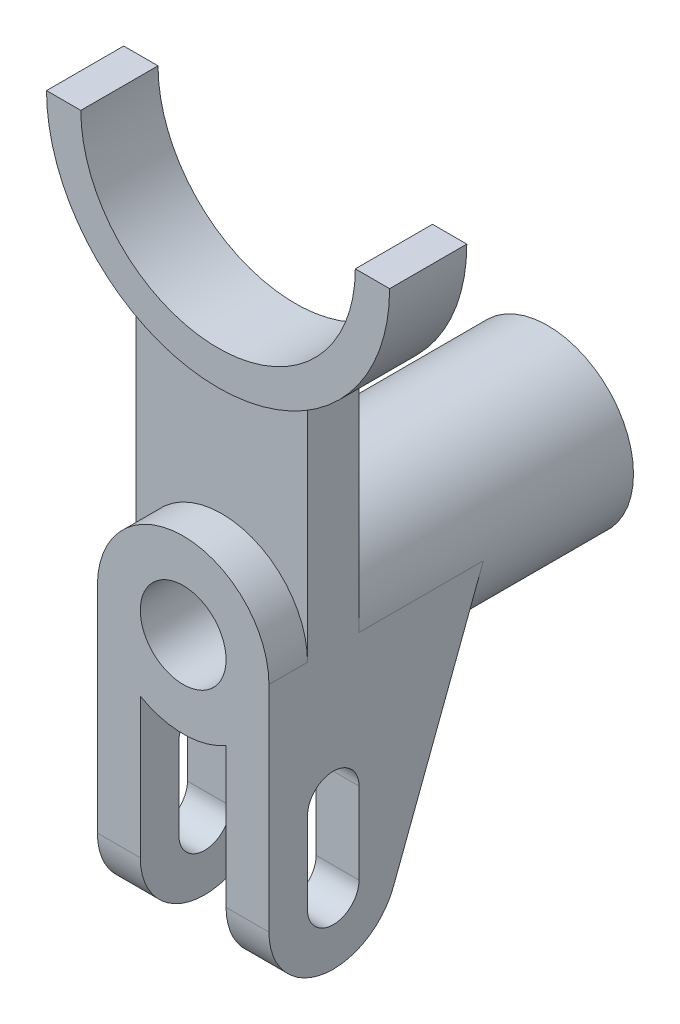
ISO-10303-21;
HEADER;
FILE_DESCRIPTION(('STEP AP214'),'2;1');
FILE_NAME('part.step','',(''),(''),'','','');
FILE_SCHEMA(('AUTOMOTIVE_DESIGN { 1 0 10303 214 1 1 1 1 }'));
ENDSEC;
DATA;
#1=APPLICATION_CONTEXT('core data for automotive mechanical design processes');
#2=APPLICATION_PROTOCOL_DEFINITION('international standard','automotive_design',2000,#1);
#3=PRODUCT_CONTEXT('',#1,'mechanical');
#4=PRODUCT('Part','Part','',(#3));
#5=PRODUCT_RELATED_PRODUCT_CATEGORY('part','',(#4));
#6=PRODUCT_DEFINITION_FORMATION('','',#4);
#7=PRODUCT_DEFINITION_CONTEXT('part definition',#1,'design');
#8=PRODUCT_DEFINITION('design','',#6,#7);
#9=PRODUCT_DEFINITION_SHAPE('','',#8);
#10=(LENGTH_UNIT() NAMED_UNIT(*) SI_UNIT(.MILLI.,.METRE.));
#11=(NAMED_UNIT(*) PLANE_ANGLE_UNIT() SI_UNIT($,.RADIAN.));
#12=(NAMED_UNIT(*) SI_UNIT($,.STERADIAN.) SOLID_ANGLE_UNIT());
#13=UNCERTAINTY_MEASURE_WITH_UNIT(LENGTH_MEASURE(1.E-05),#10,'distance_accuracy_value','');
#14=(GEOMETRIC_REPRESENTATION_CONTEXT(3) GLOBAL_UNCERTAINTY_ASSIGNED_CONTEXT((#13)) GLOBAL_UNIT_ASSIGNED_CONTEXT((#10,
#11,#12)) REPRESENTATION_CONTEXT('',''));
#15=CARTESIAN_POINT('',(0.,0.,0.));
#16=DIRECTION('',(0.,0.,1.));
#17=DIRECTION('',(1.,0.,0.));
#18=AXIS2_PLACEMENT_3D('',#15,#16,#17);
#19=CARTESIAN_POINT('',(0.,0.,-70.));
#20=DIRECTION('',(0.,0.,1.));
#21=DIRECTION('',(1.,0.,0.));
#22=AXIS2_PLACEMENT_3D('',#19,#20,#21);
#23=CYLINDRICAL_SURFACE('',#22,20.);
#24=CARTESIAN_POINT('',(0.,0.,6.));
#25=DIRECTION('',(0.,0.,1.));
#26=DIRECTION('',(1.,0.,0.));
#27=AXIS2_PLACEMENT_3D('',#24,#25,#26);
#28=CIRCLE('',#27,20.);
#29=CARTESIAN_POINT('',(20.,0.,6.00000000000001));
#30=VERTEX_POINT('',#29);
#31=CARTESIAN_POINT('',(-20.,0.,6.00000000000001));
#32=VERTEX_POINT('',#31);
#33=EDGE_CURVE('E388',#30,#32,#28,.T.);
#34=ORIENTED_EDGE('',*,*,#33,.T.);
#35=DIRECTION('',(0.,0.,1.));
#36=VECTOR('',#35,1.);
#37=CARTESIAN_POINT('',(-20.,0.,-35.));
#38=LINE('',#37,#36);
#39=CARTESIAN_POINT('',(-20.,0.,15.));
#40=VERTEX_POINT('',#39);
#41=EDGE_CURVE('E252',#32,#40,#38,.T.);
#42=ORIENTED_EDGE('',*,*,#41,.T.);
#43=CARTESIAN_POINT('',(0.,0.,15.));
#44=DIRECTION('',(0.,0.,1.));
#45=DIRECTION('',(1.,0.,0.));
#46=AXIS2_PLACEMENT_3D('',#43,#44,#45);
#47=CIRCLE('',#46,20.);
#48=CARTESIAN_POINT('',(20.,0.,15.));
#49=VERTEX_POINT('',#48);
#50=EDGE_CURVE('E371',#49,#40,#47,.T.);
#51=ORIENTED_EDGE('',*,*,#50,.F.);
#52=DIRECTION('',(0.,0.,1.));
#53=VECTOR('',#52,1.);
#54=CARTESIAN_POINT('',(20.,0.,-35.));
#55=LINE('',#54,#53);
#56=EDGE_CURVE('E325',#30,#49,#55,.T.);
#57=ORIENTED_EDGE('',*,*,#56,.F.);
#58=EDGE_LOOP('',(#34,#42,#51,#57));
#59=FACE_BOUND('',#58,.T.);
#60=ADVANCED_FACE('F41',(#59),#23,.T.);
#61=CARTESIAN_POINT('',(0.,0.,-70.));
#62=DIRECTION('',(0.,0.,1.));
#63=DIRECTION('',(1.,0.,0.));
#64=AXIS2_PLACEMENT_3D('',#61,#62,#63);
#65=CIRCLE('',#64,20.);
#66=CARTESIAN_POINT('',(20.,0.,-70.));
#67=VERTEX_POINT('',#66);
#68=EDGE_CURVE('E375',#67,#67,#65,.T.);
#69=ORIENTED_EDGE('',*,*,#68,.T.);
#70=EDGE_LOOP('',(#69));
#71=FACE_BOUND('',#70,.T.);
#72=CARTESIAN_POINT('',(-10.,-17.3205080756888,15.));
#73=VERTEX_POINT('',#72);
#74=CARTESIAN_POINT('',(10.,-17.3205080756888,15.));
#75=VERTEX_POINT('',#74);
#76=EDGE_CURVE('E370',#73,#75,#47,.T.);
#77=ORIENTED_EDGE('',*,*,#76,.F.);
#78=DIRECTION('',(0.,0.,1.));
#79=VECTOR('',#78,1.);
#80=CARTESIAN_POINT('',(-10.,-17.3205080756888,-70.));
#81=LINE('',#80,#79);
#82=CARTESIAN_POINT('',(-10.,-17.3205080756888,-28.4327635237293));
#83=VERTEX_POINT('',#82);
#84=EDGE_CURVE('E60',#73,#83,#81,.F.);
#85=ORIENTED_EDGE('',*,*,#84,.T.);
#86=CARTESIAN_POINT('',(0.,0.,-35.));
#87=DIRECTION('',(0.,0.354530986331507,0.935044266187868));
#88=DIRECTION('',(0.,-0.935044266187868,0.354530986331507));
#89=AXIS2_PLACEMENT_3D('',#86,#87,#88);
#90=ELLIPSE('',#89,21.3893616839544,20.);
#91=CARTESIAN_POINT('',(-20.,0.,-35.));
#92=VERTEX_POINT('',#91);
#93=EDGE_CURVE('E11',#83,#92,#90,.F.);
#94=ORIENTED_EDGE('',*,*,#93,.T.);
#95=CARTESIAN_POINT('',(-20.,0.,-6.));
#96=VERTEX_POINT('',#95);
#97=EDGE_CURVE('E270',#92,#96,#38,.T.);
#98=ORIENTED_EDGE('',*,*,#97,.T.);
#99=CARTESIAN_POINT('',(0.,0.,-6.));
#100=DIRECTION('',(0.,0.,1.));
#101=DIRECTION('',(1.,0.,0.));
#102=AXIS2_PLACEMENT_3D('',#99,#100,#101);
#103=CIRCLE('',#102,20.);
#104=CARTESIAN_POINT('',(20.,0.,-6.00000000000001));
#105=VERTEX_POINT('',#104);
#106=EDGE_CURVE('E403',#105,#96,#103,.T.);
#107=ORIENTED_EDGE('',*,*,#106,.F.);
#108=CARTESIAN_POINT('',(20.,0.,-35.));
#109=VERTEX_POINT('',#108);
#110=EDGE_CURVE('E348',#109,#105,#55,.T.);
#111=ORIENTED_EDGE('',*,*,#110,.F.);
#112=CARTESIAN_POINT('',(0.,0.,-35.));
#113=DIRECTION('',(0.,-0.354530986331507,-0.935044266187868));
#114=DIRECTION('',(0.,-0.935044266187868,0.354530986331507));
#115=AXIS2_PLACEMENT_3D('',#112,#113,#114);
#116=ELLIPSE('',#115,21.3893616839544,20.);
#117=CARTESIAN_POINT('',(10.,-17.3205080756888,-28.4327635237293));
#118=VERTEX_POINT('',#117);
#119=EDGE_CURVE('E50',#118,#109,#116,.F.);
#120=ORIENTED_EDGE('',*,*,#119,.F.);
#121=DIRECTION('',(0.,0.,1.));
#122=VECTOR('',#121,1.);
#123=CARTESIAN_POINT('',(10.,-17.3205080756888,-70.));
#124=LINE('',#123,#122);
#125=EDGE_CURVE('E364',#118,#75,#124,.T.);
#126=ORIENTED_EDGE('',*,*,#125,.T.);
#127=EDGE_LOOP('',(#77,#85,#94,#98,#107,#111,#120,#126));
#128=FACE_BOUND('',#127,.T.);
#129=ADVANCED_FACE('F466',(#71,#128),#23,.T.);
#130=CARTESIAN_POINT('',(2.13738691173234,88.,9.));
#131=DIRECTION('',(0.,0.,-1.));
#132=DIRECTION('',(-1.,0.,0.));
#133=AXIS2_PLACEMENT_3D('',#130,#131,#132);
#134=CYLINDRICAL_SURFACE('',#133,32.);
#135=CARTESIAN_POINT('',(2.13738691173234,88.,-9.));
#136=DIRECTION('',(0.,0.,1.));
#137=DIRECTION('',(1.,0.,0.));
#138=AXIS2_PLACEMENT_3D('',#135,#136,#137);
#139=CIRCLE('',#138,32.);
#140=CARTESIAN_POINT('',(-29.8626130882677,88.,-9.));
#141=VERTEX_POINT('',#140);
#142=CARTESIAN_POINT('',(34.1373869117323,88.,-9.));
#143=VERTEX_POINT('',#142);
#144=EDGE_CURVE('E415',#141,#143,#139,.T.);
#145=ORIENTED_EDGE('',*,*,#144,.F.);
#146=DIRECTION('',(0.,0.,-1.));
#147=VECTOR('',#146,1.);
#148=CARTESIAN_POINT('',(-29.8626130882677,88.,9.));
#149=LINE('',#148,#147);
#150=CARTESIAN_POINT('',(-29.8626130882677,88.,9.));
#151=VERTEX_POINT('',#150);
#152=EDGE_CURVE('E455',#151,#141,#149,.T.);
#153=ORIENTED_EDGE('',*,*,#152,.F.);
#154=CARTESIAN_POINT('',(2.13738691173234,88.,9.));
#155=DIRECTION('',(0.,0.,1.));
#156=DIRECTION('',(1.,0.,0.));
#157=AXIS2_PLACEMENT_3D('',#154,#155,#156);
#158=CIRCLE('',#157,32.);
#159=CARTESIAN_POINT('',(34.1373869117323,88.,9.));
#160=VERTEX_POINT('',#159);
#161=EDGE_CURVE('E416',#151,#160,#158,.T.);
#162=ORIENTED_EDGE('',*,*,#161,.T.);
#163=DIRECTION('',(0.,0.,-1.));
#164=VECTOR('',#163,1.);
#165=CARTESIAN_POINT('',(34.1373869117323,88.,9.));
#166=LINE('',#165,#164);
#167=EDGE_CURVE('E432',#160,#143,#166,.T.);
#168=ORIENTED_EDGE('',*,*,#167,.T.);
#169=EDGE_LOOP('',(#145,#153,#162,#168));
#170=FACE_BOUND('',#169,.T.);
#171=ADVANCED_FACE('F43',(#170),#134,.F.);
#172=CARTESIAN_POINT('',(0.,88.,9.));
#173=DIRECTION('',(0.,1.,0.));
#174=DIRECTION('',(0.,0.,1.));
#175=AXIS2_PLACEMENT_3D('',#172,#173,#174);
#176=PLANE('',#175);
#177=DIRECTION('',(1.,0.,0.));
#178=VECTOR('',#177,1.);
#179=CARTESIAN_POINT('',(0.,88.,-9.));
#180=LINE('',#179,#178);
#181=CARTESIAN_POINT('',(-37.8626130882677,88.,-9.));
#182=VERTEX_POINT('',#181);
#183=EDGE_CURVE('E436',#182,#141,#180,.T.);
#184=ORIENTED_EDGE('',*,*,#183,.F.);
#185=DIRECTION('',(0.,0.,-1.));
#186=VECTOR('',#185,1.);
#187=CARTESIAN_POINT('',(-37.8626130882677,88.,9.));
#188=LINE('',#187,#186);
#189=CARTESIAN_POINT('',(-37.8626130882677,88.,9.));
#190=VERTEX_POINT('',#189);
#191=EDGE_CURVE('E452',#190,#182,#188,.T.);
#192=ORIENTED_EDGE('',*,*,#191,.F.);
#193=DIRECTION('',(1.,0.,0.));
#194=VECTOR('',#193,1.);
#195=CARTESIAN_POINT('',(0.,88.,9.));
#196=LINE('',#195,#194);
#197=EDGE_CURVE('E420',#190,#151,#196,.T.);
#198=ORIENTED_EDGE('',*,*,#197,.T.);
#199=ORIENTED_EDGE('',*,*,#152,.T.);
#200=EDGE_LOOP('',(#184,#192,#198,#199));
#201=FACE_BOUND('',#200,.T.);
#202=ADVANCED_FACE('F550',(#201),#176,.T.);
#203=CARTESIAN_POINT('',(2.13738691173234,88.,9.));
#204=DIRECTION('',(0.,0.,-1.));
#205=DIRECTION('',(-1.,0.,0.));
#206=AXIS2_PLACEMENT_3D('',#203,#204,#205);
#207=CYLINDRICAL_SURFACE('',#206,40.);
#208=DIRECTION('',(0.,0.,-1.));
#209=VECTOR('',#208,1.);
#210=CARTESIAN_POINT('',(-20.,54.6842964846867,6.));
#211=LINE('',#210,#209);
#212=CARTESIAN_POINT('',(-20.,54.6842964846867,6.));
#213=VERTEX_POINT('',#212);
#214=CARTESIAN_POINT('',(-20.,54.6842964846867,-6.));
#215=VERTEX_POINT('',#214);
#216=EDGE_CURVE('E411',#213,#215,#211,.T.);
#217=ORIENTED_EDGE('',*,*,#216,.F.);
#218=CARTESIAN_POINT('',(2.13738691173234,88.,6.));
#219=DIRECTION('',(0.,0.,1.));
#220=DIRECTION('',(1.,0.,0.));
#221=AXIS2_PLACEMENT_3D('',#218,#219,#220);
#222=CIRCLE('',#221,40.);
#223=CARTESIAN_POINT('',(20.,52.209958736279,6.));
#224=VERTEX_POINT('',#223);
#225=EDGE_CURVE('E380',#213,#224,#222,.T.);
#226=ORIENTED_EDGE('',*,*,#225,.T.);
#227=DIRECTION('',(0.,0.,-1.));
#228=VECTOR('',#227,1.);
#229=CARTESIAN_POINT('',(20.,52.209958736279,6.));
#230=LINE('',#229,#228);
#231=CARTESIAN_POINT('',(20.,52.209958736279,-6.));
#232=VERTEX_POINT('',#231);
#233=EDGE_CURVE('E395',#224,#232,#230,.T.);
#234=ORIENTED_EDGE('',*,*,#233,.T.);
#235=CARTESIAN_POINT('',(2.13738691173234,88.,-6.));
#236=DIRECTION('',(0.,0.,1.));
#237=DIRECTION('',(1.,0.,0.));
#238=AXIS2_PLACEMENT_3D('',#235,#236,#237);
#239=CIRCLE('',#238,40.);
#240=EDGE_CURVE('E379',#215,#232,#239,.T.);
#241=ORIENTED_EDGE('',*,*,#240,.F.);
#242=EDGE_LOOP('',(#217,#226,#234,#241));
#243=FACE_BOUND('',#242,.T.);
#244=CARTESIAN_POINT('',(2.13738691173234,88.,-9.));
#245=DIRECTION('',(0.,0.,1.));
#246=DIRECTION('',(1.,0.,0.));
#247=AXIS2_PLACEMENT_3D('',#244,#245,#246);
#248=CIRCLE('',#247,40.);
#249=CARTESIAN_POINT('',(42.1373869117323,88.,-9.));
#250=VERTEX_POINT('',#249);
#251=EDGE_CURVE('E440',#182,#250,#248,.T.);
#252=ORIENTED_EDGE('',*,*,#251,.T.);
#253=DIRECTION('',(0.,0.,-1.));
#254=VECTOR('',#253,1.);
#255=CARTESIAN_POINT('',(42.1373869117323,88.,9.));
#256=LINE('',#255,#254);
#257=CARTESIAN_POINT('',(42.1373869117323,88.,9.));
#258=VERTEX_POINT('',#257);
#259=EDGE_CURVE('E449',#258,#250,#256,.T.);
#260=ORIENTED_EDGE('',*,*,#259,.F.);
#261=CARTESIAN_POINT('',(2.13738691173234,88.,9.));
#262=DIRECTION('',(0.,0.,1.));
#263=DIRECTION('',(1.,0.,0.));
#264=AXIS2_PLACEMENT_3D('',#261,#262,#263);
#265=CIRCLE('',#264,40.);
#266=EDGE_CURVE('E425',#190,#258,#265,.T.);
#267=ORIENTED_EDGE('',*,*,#266,.F.);
#268=ORIENTED_EDGE('',*,*,#191,.T.);
#269=EDGE_LOOP('',(#252,#260,#267,#268));
#270=FACE_BOUND('',#269,.T.);
#271=ADVANCED_FACE('F506',(#243,#270),#207,.T.);
#272=CARTESIAN_POINT('',(0.,88.,9.));
#273=DIRECTION('',(0.,1.,0.));
#274=DIRECTION('',(0.,0.,1.));
#275=AXIS2_PLACEMENT_3D('',#272,#273,#274);
#276=PLANE('',#275);
#277=DIRECTION('',(1.,0.,0.));
#278=VECTOR('',#277,1.);
#279=CARTESIAN_POINT('',(0.,88.,-9.));
#280=LINE('',#279,#278);
#281=EDGE_CURVE('E421',#143,#250,#280,.T.);
#282=ORIENTED_EDGE('',*,*,#281,.F.);
#283=ORIENTED_EDGE('',*,*,#167,.F.);
#284=DIRECTION('',(1.,0.,0.));
#285=VECTOR('',#284,1.);
#286=CARTESIAN_POINT('',(0.,88.,9.));
#287=LINE('',#286,#285);
#288=EDGE_CURVE('E428',#160,#258,#287,.T.);
#289=ORIENTED_EDGE('',*,*,#288,.T.);
#290=ORIENTED_EDGE('',*,*,#259,.T.);
#291=EDGE_LOOP('',(#282,#283,#289,#290));
#292=FACE_BOUND('',#291,.T.);
#293=ADVANCED_FACE('F541',(#292),#276,.T.);
#294=CARTESIAN_POINT('',(0.,0.,9.));
#295=DIRECTION('',(0.,0.,1.));
#296=DIRECTION('',(1.,0.,0.));
#297=AXIS2_PLACEMENT_3D('',#294,#295,#296);
#298=PLANE('',#297);
#299=ORIENTED_EDGE('',*,*,#161,.F.);
#300=ORIENTED_EDGE('',*,*,#197,.F.);
#301=ORIENTED_EDGE('',*,*,#266,.T.);
#302=ORIENTED_EDGE('',*,*,#288,.F.);
#303=EDGE_LOOP('',(#299,#300,#301,#302));
#304=FACE_BOUND('',#303,.T.);
#305=ADVANCED_FACE('F538',(#304),#298,.T.);
#306=CARTESIAN_POINT('',(0.,0.,-9.));
#307=DIRECTION('',(0.,0.,1.));
#308=DIRECTION('',(1.,0.,0.));
#309=AXIS2_PLACEMENT_3D('',#306,#307,#308);
#310=PLANE('',#309);
#311=ORIENTED_EDGE('',*,*,#144,.T.);
#312=ORIENTED_EDGE('',*,*,#281,.T.);
#313=ORIENTED_EDGE('',*,*,#251,.F.);
#314=ORIENTED_EDGE('',*,*,#183,.T.);
#315=EDGE_LOOP('',(#311,#312,#313,#314));
#316=FACE_BOUND('',#315,.T.);
#317=ADVANCED_FACE('F537',(#316),#310,.F.);
#318=CARTESIAN_POINT('',(-20.,0.,6.));
#319=DIRECTION('',(-1.,0.,0.));
#320=DIRECTION('',(0.,0.,1.));
#321=AXIS2_PLACEMENT_3D('',#318,#319,#320);
#322=PLANE('',#321);
#323=DIRECTION('',(0.,1.,0.));
#324=VECTOR('',#323,1.);
#325=CARTESIAN_POINT('',(-20.,0.,-6.));
#326=LINE('',#325,#324);
#327=EDGE_CURVE('E399',#96,#215,#326,.T.);
#328=ORIENTED_EDGE('',*,*,#327,.F.);
#329=ORIENTED_EDGE('',*,*,#97,.F.);
#330=DIRECTION('',(0.,0.935044266187868,-0.354530986331507));
#331=VECTOR('',#330,1.);
#332=CARTESIAN_POINT('',(-20.,-55.3179647949726,-14.025663992818));
#333=LINE('',#332,#331);
#334=CARTESIAN_POINT('',(-20.,-55.3179647949726,-14.025663992818));
#335=VERTEX_POINT('',#334);
#336=EDGE_CURVE('E273',#335,#92,#333,.T.);
#337=ORIENTED_EDGE('',*,*,#336,.F.);
#338=CARTESIAN_POINT('',(-20.,-50.,0.));
#339=DIRECTION('',(1.,0.,0.));
#340=DIRECTION('',(0.,0.,-1.));
#341=AXIS2_PLACEMENT_3D('',#338,#339,#340);
#342=CIRCLE('',#341,15.);
#343=CARTESIAN_POINT('',(-20.,-50.,15.));
#344=VERTEX_POINT('',#343);
#345=EDGE_CURVE('E276',#344,#335,#342,.T.);
#346=ORIENTED_EDGE('',*,*,#345,.F.);
#347=DIRECTION('',(0.,-1.,0.));
#348=VECTOR('',#347,1.);
#349=CARTESIAN_POINT('',(-20.,0.,15.));
#350=LINE('',#349,#348);
#351=EDGE_CURVE('E263',#40,#344,#350,.T.);
#352=ORIENTED_EDGE('',*,*,#351,.F.);
#353=ORIENTED_EDGE('',*,*,#41,.F.);
#354=DIRECTION('',(0.,1.,0.));
#355=VECTOR('',#354,1.);
#356=CARTESIAN_POINT('',(-20.,0.,6.));
#357=LINE('',#356,#355);
#358=EDGE_CURVE('E383',#32,#213,#357,.T.);
#359=ORIENTED_EDGE('',*,*,#358,.T.);
#360=ORIENTED_EDGE('',*,*,#216,.T.);
#361=EDGE_LOOP('',(#328,#329,#337,#346,#352,#353,#359,#360));
#362=FACE_BOUND('',#361,.T.);
#363=DIRECTION('',(0.,-1.,0.));
#364=VECTOR('',#363,1.);
#365=CARTESIAN_POINT('',(-20.,-50.,5.99999999999999));
#366=LINE('',#365,#364);
#367=CARTESIAN_POINT('',(-20.,-31.,5.99999999999999));
#368=VERTEX_POINT('',#367);
#369=CARTESIAN_POINT('',(-20.,-50.,5.99999999999999));
#370=VERTEX_POINT('',#369);
#371=EDGE_CURVE('E243',#368,#370,#366,.T.);
#372=ORIENTED_EDGE('',*,*,#371,.T.);
#373=CARTESIAN_POINT('',(-20.,-50.,0.));
#374=DIRECTION('',(1.,0.,0.));
#375=DIRECTION('',(0.,0.,-1.));
#376=AXIS2_PLACEMENT_3D('',#373,#374,#375);
#377=CIRCLE('',#376,6.);
#378=CARTESIAN_POINT('',(-20.,-50.,-6.00000000000001));
#379=VERTEX_POINT('',#378);
#380=EDGE_CURVE('E220',#370,#379,#377,.T.);
#381=ORIENTED_EDGE('',*,*,#380,.T.);
#382=DIRECTION('',(0.,1.,0.));
#383=VECTOR('',#382,1.);
#384=CARTESIAN_POINT('',(-20.,-50.,-6.00000000000001));
#385=LINE('',#384,#383);
#386=CARTESIAN_POINT('',(-20.,-31.,-6.00000000000001));
#387=VERTEX_POINT('',#386);
#388=EDGE_CURVE('E227',#379,#387,#385,.T.);
#389=ORIENTED_EDGE('',*,*,#388,.T.);
#390=CARTESIAN_POINT('',(-20.,-31.,0.));
#391=DIRECTION('',(1.,0.,0.));
#392=DIRECTION('',(0.,0.,-1.));
#393=AXIS2_PLACEMENT_3D('',#390,#391,#392);
#394=CIRCLE('',#393,6.);
#395=EDGE_CURVE('E231',#387,#368,#394,.T.);
#396=ORIENTED_EDGE('',*,*,#395,.T.);
#397=EDGE_LOOP('',(#372,#381,#389,#396));
#398=FACE_BOUND('',#397,.T.);
#399=ADVANCED_FACE('F501',(#362,#398),#322,.T.);
#400=CARTESIAN_POINT('',(20.,0.,6.));
#401=DIRECTION('',(-1.,0.,0.));
#402=DIRECTION('',(0.,0.,1.));
#403=AXIS2_PLACEMENT_3D('',#400,#401,#402);
#404=PLANE('',#403);
#405=DIRECTION('',(0.,1.,0.));
#406=VECTOR('',#405,1.);
#407=CARTESIAN_POINT('',(20.,0.,-6.));
#408=LINE('',#407,#406);
#409=EDGE_CURVE('E384',#105,#232,#408,.T.);
#410=ORIENTED_EDGE('',*,*,#409,.T.);
#411=ORIENTED_EDGE('',*,*,#233,.F.);
#412=DIRECTION('',(0.,1.,0.));
#413=VECTOR('',#412,1.);
#414=CARTESIAN_POINT('',(20.,0.,6.));
#415=LINE('',#414,#413);
#416=EDGE_CURVE('E391',#30,#224,#415,.T.);
#417=ORIENTED_EDGE('',*,*,#416,.F.);
#418=ORIENTED_EDGE('',*,*,#56,.T.);
#419=DIRECTION('',(0.,-1.,0.));
#420=VECTOR('',#419,1.);
#421=CARTESIAN_POINT('',(20.,0.,15.));
#422=LINE('',#421,#420);
#423=CARTESIAN_POINT('',(20.,-50.,15.));
#424=VERTEX_POINT('',#423);
#425=EDGE_CURVE('E351',#49,#424,#422,.T.);
#426=ORIENTED_EDGE('',*,*,#425,.T.);
#427=CARTESIAN_POINT('',(20.,-50.,0.));
#428=DIRECTION('',(1.,0.,0.));
#429=DIRECTION('',(0.,0.,-1.));
#430=AXIS2_PLACEMENT_3D('',#427,#428,#429);
#431=CIRCLE('',#430,15.);
#432=CARTESIAN_POINT('',(20.,-55.3179647949726,-14.025663992818));
#433=VERTEX_POINT('',#432);
#434=EDGE_CURVE('E355',#424,#433,#431,.T.);
#435=ORIENTED_EDGE('',*,*,#434,.T.);
#436=DIRECTION('',(0.,0.935044266187868,-0.354530986331507));
#437=VECTOR('',#436,1.);
#438=CARTESIAN_POINT('',(20.,-55.3179647949726,-14.025663992818));
#439=LINE('',#438,#437);
#440=EDGE_CURVE('E339',#433,#109,#439,.T.);
#441=ORIENTED_EDGE('',*,*,#440,.T.);
#442=ORIENTED_EDGE('',*,*,#110,.T.);
#443=EDGE_LOOP('',(#410,#411,#417,#418,#426,#435,#441,#442));
#444=FACE_BOUND('',#443,.T.);
#445=CARTESIAN_POINT('',(20.,-50.,0.));
#446=DIRECTION('',(1.,0.,0.));
#447=DIRECTION('',(0.,0.,-1.));
#448=AXIS2_PLACEMENT_3D('',#445,#446,#447);
#449=CIRCLE('',#448,6.);
#450=CARTESIAN_POINT('',(20.,-50.,5.99999999999999));
#451=VERTEX_POINT('',#450);
#452=CARTESIAN_POINT('',(20.,-50.,-6.00000000000001));
#453=VERTEX_POINT('',#452);
#454=EDGE_CURVE('E290',#451,#453,#449,.T.);
#455=ORIENTED_EDGE('',*,*,#454,.F.);
#456=DIRECTION('',(0.,-1.,0.));
#457=VECTOR('',#456,1.);
#458=CARTESIAN_POINT('',(20.,-50.,5.99999999999999));
#459=LINE('',#458,#457);
#460=CARTESIAN_POINT('',(20.,-31.,5.99999999999999));
#461=VERTEX_POINT('',#460);
#462=EDGE_CURVE('E296',#461,#451,#459,.T.);
#463=ORIENTED_EDGE('',*,*,#462,.F.);
#464=CARTESIAN_POINT('',(20.,-31.,0.));
#465=DIRECTION('',(1.,0.,0.));
#466=DIRECTION('',(0.,0.,-1.));
#467=AXIS2_PLACEMENT_3D('',#464,#465,#466);
#468=CIRCLE('',#467,6.);
#469=CARTESIAN_POINT('',(20.,-31.,-6.00000000000001));
#470=VERTEX_POINT('',#469);
#471=EDGE_CURVE('E315',#470,#461,#468,.T.);
#472=ORIENTED_EDGE('',*,*,#471,.F.);
#473=DIRECTION('',(0.,1.,0.));
#474=VECTOR('',#473,1.);
#475=CARTESIAN_POINT('',(20.,-50.,-6.00000000000001));
#476=LINE('',#475,#474);
#477=EDGE_CURVE('E311',#453,#470,#476,.T.);
#478=ORIENTED_EDGE('',*,*,#477,.F.);
#479=EDGE_LOOP('',(#455,#463,#472,#478));
#480=FACE_BOUND('',#479,.T.);
#481=ADVANCED_FACE('F469',(#444,#480),#404,.F.);
#482=CARTESIAN_POINT('',(0.,0.,6.));
#483=DIRECTION('',(0.,0.,1.));
#484=DIRECTION('',(1.,0.,0.));
#485=AXIS2_PLACEMENT_3D('',#482,#483,#484);
#486=PLANE('',#485);
#487=ORIENTED_EDGE('',*,*,#225,.F.);
#488=ORIENTED_EDGE('',*,*,#358,.F.);
#489=ORIENTED_EDGE('',*,*,#33,.F.);
#490=ORIENTED_EDGE('',*,*,#416,.T.);
#491=EDGE_LOOP('',(#487,#488,#489,#490));
#492=FACE_BOUND('',#491,.T.);
#493=ADVANCED_FACE('F513',(#492),#486,.T.);
#494=CARTESIAN_POINT('',(0.,0.,-6.));
#495=DIRECTION('',(0.,0.,1.));
#496=DIRECTION('',(1.,0.,0.));
#497=AXIS2_PLACEMENT_3D('',#494,#495,#496);
#498=PLANE('',#497);
#499=ORIENTED_EDGE('',*,*,#240,.T.);
#500=ORIENTED_EDGE('',*,*,#409,.F.);
#501=ORIENTED_EDGE('',*,*,#106,.T.);
#502=ORIENTED_EDGE('',*,*,#327,.T.);
#503=EDGE_LOOP('',(#499,#500,#501,#502));
#504=FACE_BOUND('',#503,.T.);
#505=ADVANCED_FACE('F504',(#504),#498,.F.);
#506=CARTESIAN_POINT('',(0.,0.,-70.));
#507=DIRECTION('',(0.,0.,1.));
#508=DIRECTION('',(1.,0.,0.));
#509=AXIS2_PLACEMENT_3D('',#506,#507,#508);
#510=PLANE('',#509);
#511=CARTESIAN_POINT('',(0.,0.,-70.));
#512=DIRECTION('',(0.,0.,1.));
#513=DIRECTION('',(1.,0.,0.));
#514=AXIS2_PLACEMENT_3D('',#511,#512,#513);
#515=CIRCLE('',#514,9.99999999999999);
#516=CARTESIAN_POINT('',(9.99999999999999,0.,-70.));
#517=VERTEX_POINT('',#516);
#518=EDGE_CURVE('E234',#517,#517,#515,.T.);
#519=ORIENTED_EDGE('',*,*,#518,.T.);
#520=EDGE_LOOP('',(#519));
#521=FACE_BOUND('',#520,.T.);
#522=ORIENTED_EDGE('',*,*,#68,.F.);
#523=EDGE_LOOP('',(#522));
#524=FACE_BOUND('',#523,.T.);
#525=ADVANCED_FACE('F527',(#521,#524),#510,.F.);
#526=CARTESIAN_POINT('',(0.,0.,15.));
#527=DIRECTION('',(0.,0.,1.));
#528=DIRECTION('',(1.,0.,0.));
#529=AXIS2_PLACEMENT_3D('',#526,#527,#528);
#530=PLANE('',#529);
#531=CARTESIAN_POINT('',(0.,0.,15.));
#532=DIRECTION('',(0.,0.,1.));
#533=DIRECTION('',(1.,0.,0.));
#534=AXIS2_PLACEMENT_3D('',#531,#532,#533);
#535=CIRCLE('',#534,10.);
#536=CARTESIAN_POINT('',(10.,0.,15.));
#537=VERTEX_POINT('',#536);
#538=EDGE_CURVE('E807',#537,#537,#535,.T.);
#539=ORIENTED_EDGE('',*,*,#538,.F.);
#540=EDGE_LOOP('',(#539));
#541=FACE_BOUND('',#540,.T.);
#542=ORIENTED_EDGE('',*,*,#50,.T.);
#543=ORIENTED_EDGE('',*,*,#351,.T.);
#544=DIRECTION('',(-1.,0.,0.));
#545=VECTOR('',#544,1.);
#546=CARTESIAN_POINT('',(-10.,-50.,15.));
#547=LINE('',#546,#545);
#548=CARTESIAN_POINT('',(-10.,-50.,15.));
#549=VERTEX_POINT('',#548);
#550=EDGE_CURVE('E281',#549,#344,#547,.T.);
#551=ORIENTED_EDGE('',*,*,#550,.F.);
#552=DIRECTION('',(0.,-1.,0.));
#553=VECTOR('',#552,1.);
#554=CARTESIAN_POINT('',(-10.,0.,15.));
#555=LINE('',#554,#553);
#556=EDGE_CURVE('E266',#73,#549,#555,.T.);
#557=ORIENTED_EDGE('',*,*,#556,.F.);
#558=ORIENTED_EDGE('',*,*,#76,.T.);
#559=DIRECTION('',(0.,-1.,0.));
#560=VECTOR('',#559,1.);
#561=CARTESIAN_POINT('',(10.,0.,15.));
#562=LINE('',#561,#560);
#563=CARTESIAN_POINT('',(10.,-50.,15.));
#564=VERTEX_POINT('',#563);
#565=EDGE_CURVE('E335',#75,#564,#562,.T.);
#566=ORIENTED_EDGE('',*,*,#565,.T.);
#567=DIRECTION('',(1.,0.,0.));
#568=VECTOR('',#567,1.);
#569=CARTESIAN_POINT('',(10.,-50.,15.));
#570=LINE('',#569,#568);
#571=EDGE_CURVE('E347',#564,#424,#570,.T.);
#572=ORIENTED_EDGE('',*,*,#571,.T.);
#573=ORIENTED_EDGE('',*,*,#425,.F.);
#574=EDGE_LOOP('',(#542,#543,#551,#557,#558,#566,#572,#573));
#575=FACE_BOUND('',#574,.T.);
#576=ADVANCED_FACE('F488',(#541,#575),#530,.T.);
#577=CARTESIAN_POINT('',(10.,-55.3179647949726,-14.025663992818));
#578=DIRECTION('',(0.,-0.354530986331507,-0.935044266187868));
#579=DIRECTION('',(0.,0.935044266187868,-0.354530986331507));
#580=AXIS2_PLACEMENT_3D('',#577,#578,#579);
#581=PLANE('',#580);
#582=DIRECTION('',(0.,0.935044266187868,-0.354530986331507));
#583=VECTOR('',#582,1.);
#584=CARTESIAN_POINT('',(10.,-55.3179647949726,-14.025663992818));
#585=LINE('',#584,#583);
#586=CARTESIAN_POINT('',(10.,-55.3179647949726,-14.025663992818));
#587=VERTEX_POINT('',#586);
#588=EDGE_CURVE('E343',#587,#118,#585,.T.);
#589=ORIENTED_EDGE('',*,*,#588,.T.);
#590=ORIENTED_EDGE('',*,*,#119,.T.);
#591=ORIENTED_EDGE('',*,*,#440,.F.);
#592=DIRECTION('',(1.,0.,0.));
#593=VECTOR('',#592,1.);
#594=CARTESIAN_POINT('',(10.,-55.3179647949726,-14.025663992818));
#595=LINE('',#594,#593);
#596=EDGE_CURVE('E361',#587,#433,#595,.T.);
#597=ORIENTED_EDGE('',*,*,#596,.F.);
#598=EDGE_LOOP('',(#589,#590,#591,#597));
#599=FACE_BOUND('',#598,.T.);
#600=ADVANCED_FACE('F463',(#599),#581,.T.);
#601=CARTESIAN_POINT('',(10.,-50.,0.));
#602=DIRECTION('',(1.,0.,0.));
#603=DIRECTION('',(0.,0.,-1.));
#604=AXIS2_PLACEMENT_3D('',#601,#602,#603);
#605=CYLINDRICAL_SURFACE('',#604,15.);
#606=ORIENTED_EDGE('',*,*,#434,.F.);
#607=ORIENTED_EDGE('',*,*,#571,.F.);
#608=CARTESIAN_POINT('',(10.,-50.,0.));
#609=DIRECTION('',(1.,0.,0.));
#610=DIRECTION('',(0.,0.,-1.));
#611=AXIS2_PLACEMENT_3D('',#608,#609,#610);
#612=CIRCLE('',#611,15.);
#613=EDGE_CURVE('E338',#564,#587,#612,.T.);
#614=ORIENTED_EDGE('',*,*,#613,.T.);
#615=ORIENTED_EDGE('',*,*,#596,.T.);
#616=EDGE_LOOP('',(#606,#607,#614,#615));
#617=FACE_BOUND('',#616,.T.);
#618=ADVANCED_FACE('F476',(#617),#605,.T.);
#619=CARTESIAN_POINT('',(10.,-50.,0.));
#620=DIRECTION('',(1.,0.,0.));
#621=DIRECTION('',(0.,0.,-1.));
#622=AXIS2_PLACEMENT_3D('',#619,#620,#621);
#623=PLANE('',#622);
#624=ORIENTED_EDGE('',*,*,#125,.F.);
#625=ORIENTED_EDGE('',*,*,#588,.F.);
#626=ORIENTED_EDGE('',*,*,#613,.F.);
#627=ORIENTED_EDGE('',*,*,#565,.F.);
#628=EDGE_LOOP('',(#624,#625,#626,#627));
#629=FACE_BOUND('',#628,.T.);
#630=DIRECTION('',(0.,-1.,0.));
#631=VECTOR('',#630,1.);
#632=CARTESIAN_POINT('',(10.,-50.,5.99999999999999));
#633=LINE('',#632,#631);
#634=CARTESIAN_POINT('',(10.,-31.,5.99999999999999));
#635=VERTEX_POINT('',#634);
#636=CARTESIAN_POINT('',(10.,-50.,5.99999999999999));
#637=VERTEX_POINT('',#636);
#638=EDGE_CURVE('E304',#635,#637,#633,.T.);
#639=ORIENTED_EDGE('',*,*,#638,.T.);
#640=CARTESIAN_POINT('',(10.,-50.,0.));
#641=DIRECTION('',(1.,0.,0.));
#642=DIRECTION('',(0.,0.,-1.));
#643=AXIS2_PLACEMENT_3D('',#640,#641,#642);
#644=CIRCLE('',#643,6.);
#645=CARTESIAN_POINT('',(10.,-50.,-6.00000000000001));
#646=VERTEX_POINT('',#645);
#647=EDGE_CURVE('E291',#637,#646,#644,.T.);
#648=ORIENTED_EDGE('',*,*,#647,.T.);
#649=DIRECTION('',(0.,1.,0.));
#650=VECTOR('',#649,1.);
#651=CARTESIAN_POINT('',(10.,-50.,-6.00000000000001));
#652=LINE('',#651,#650);
#653=CARTESIAN_POINT('',(10.,-31.,-6.00000000000001));
#654=VERTEX_POINT('',#653);
#655=EDGE_CURVE('E295',#646,#654,#652,.T.);
#656=ORIENTED_EDGE('',*,*,#655,.T.);
#657=CARTESIAN_POINT('',(10.,-31.,0.));
#658=DIRECTION('',(1.,0.,0.));
#659=DIRECTION('',(0.,0.,-1.));
#660=AXIS2_PLACEMENT_3D('',#657,#658,#659);
#661=CIRCLE('',#660,6.);
#662=EDGE_CURVE('E300',#654,#635,#661,.T.);
#663=ORIENTED_EDGE('',*,*,#662,.T.);
#664=EDGE_LOOP('',(#639,#648,#656,#663));
#665=FACE_BOUND('',#664,.T.);
#666=ADVANCED_FACE('F480',(#629,#665),#623,.F.);
#667=CARTESIAN_POINT('',(10.,-50.,0.));
#668=DIRECTION('',(1.,0.,0.));
#669=DIRECTION('',(0.,0.,-1.));
#670=AXIS2_PLACEMENT_3D('',#667,#668,#669);
#671=CYLINDRICAL_SURFACE('',#670,6.);
#672=ORIENTED_EDGE('',*,*,#454,.T.);
#673=DIRECTION('',(1.,0.,0.));
#674=VECTOR('',#673,1.);
#675=CARTESIAN_POINT('',(10.,-50.,-6.00000000000001));
#676=LINE('',#675,#674);
#677=EDGE_CURVE('E308',#646,#453,#676,.T.);
#678=ORIENTED_EDGE('',*,*,#677,.F.);
#679=ORIENTED_EDGE('',*,*,#647,.F.);
#680=DIRECTION('',(1.,0.,0.));
#681=VECTOR('',#680,1.);
#682=CARTESIAN_POINT('',(10.,-50.,5.99999999999999));
#683=LINE('',#682,#681);
#684=EDGE_CURVE('E322',#637,#451,#683,.T.);
#685=ORIENTED_EDGE('',*,*,#684,.T.);
#686=EDGE_LOOP('',(#672,#678,#679,#685));
#687=FACE_BOUND('',#686,.T.);
#688=ADVANCED_FACE('F693',(#687),#671,.F.);
#689=CARTESIAN_POINT('',(10.,-50.,5.99999999999999));
#690=DIRECTION('',(0.,0.,1.));
#691=DIRECTION('',(1.,0.,0.));
#692=AXIS2_PLACEMENT_3D('',#689,#690,#691);
#693=PLANE('',#692);
#694=ORIENTED_EDGE('',*,*,#462,.T.);
#695=ORIENTED_EDGE('',*,*,#684,.F.);
#696=ORIENTED_EDGE('',*,*,#638,.F.);
#697=DIRECTION('',(1.,0.,0.));
#698=VECTOR('',#697,1.);
#699=CARTESIAN_POINT('',(10.,-31.,5.99999999999999));
#700=LINE('',#699,#698);
#701=EDGE_CURVE('E326',#635,#461,#700,.T.);
#702=ORIENTED_EDGE('',*,*,#701,.T.);
#703=EDGE_LOOP('',(#694,#695,#696,#702));
#704=FACE_BOUND('',#703,.T.);
#705=ADVANCED_FACE('F689',(#704),#693,.F.);
#706=CARTESIAN_POINT('',(10.,-31.,0.));
#707=DIRECTION('',(1.,0.,0.));
#708=DIRECTION('',(0.,0.,-1.));
#709=AXIS2_PLACEMENT_3D('',#706,#707,#708);
#710=CYLINDRICAL_SURFACE('',#709,6.);
#711=ORIENTED_EDGE('',*,*,#471,.T.);
#712=ORIENTED_EDGE('',*,*,#701,.F.);
#713=ORIENTED_EDGE('',*,*,#662,.F.);
#714=DIRECTION('',(1.,0.,0.));
#715=VECTOR('',#714,1.);
#716=CARTESIAN_POINT('',(10.,-31.,-6.00000000000001));
#717=LINE('',#716,#715);
#718=EDGE_CURVE('E329',#654,#470,#717,.T.);
#719=ORIENTED_EDGE('',*,*,#718,.T.);
#720=EDGE_LOOP('',(#711,#712,#713,#719));
#721=FACE_BOUND('',#720,.T.);
#722=ADVANCED_FACE('F692',(#721),#710,.F.);
#723=CARTESIAN_POINT('',(10.,-50.,-6.00000000000001));
#724=DIRECTION('',(0.,0.,-1.));
#725=DIRECTION('',(-1.,0.,0.));
#726=AXIS2_PLACEMENT_3D('',#723,#724,#725);
#727=PLANE('',#726);
#728=ORIENTED_EDGE('',*,*,#477,.T.);
#729=ORIENTED_EDGE('',*,*,#718,.F.);
#730=ORIENTED_EDGE('',*,*,#655,.F.);
#731=ORIENTED_EDGE('',*,*,#677,.T.);
#732=EDGE_LOOP('',(#728,#729,#730,#731));
#733=FACE_BOUND('',#732,.T.);
#734=ADVANCED_FACE('F601',(#733),#727,.F.);
#735=CARTESIAN_POINT('',(-10.,-50.,0.));
#736=DIRECTION('',(-1.,0.,0.));
#737=DIRECTION('',(0.,0.,-1.));
#738=AXIS2_PLACEMENT_3D('',#735,#736,#737);
#739=PLANE('',#738);
#740=ORIENTED_EDGE('',*,*,#84,.F.);
#741=ORIENTED_EDGE('',*,*,#556,.T.);
#742=CARTESIAN_POINT('',(-10.,-50.,0.));
#743=DIRECTION('',(1.,0.,0.));
#744=DIRECTION('',(0.,0.,-1.));
#745=AXIS2_PLACEMENT_3D('',#742,#743,#744);
#746=CIRCLE('',#745,15.);
#747=CARTESIAN_POINT('',(-10.,-55.3179647949726,-14.025663992818));
#748=VERTEX_POINT('',#747);
#749=EDGE_CURVE('E262',#549,#748,#746,.T.);
#750=ORIENTED_EDGE('',*,*,#749,.T.);
#751=DIRECTION('',(0.,0.935044266187868,-0.354530986331507));
#752=VECTOR('',#751,1.);
#753=CARTESIAN_POINT('',(-10.,-55.3179647949726,-14.025663992818));
#754=LINE('',#753,#752);
#755=EDGE_CURVE('E258',#748,#83,#754,.T.);
#756=ORIENTED_EDGE('',*,*,#755,.T.);
#757=EDGE_LOOP('',(#740,#741,#750,#756));
#758=FACE_BOUND('',#757,.T.);
#759=CARTESIAN_POINT('',(-10.,-50.,0.));
#760=DIRECTION('',(1.,0.,0.));
#761=DIRECTION('',(0.,0.,-1.));
#762=AXIS2_PLACEMENT_3D('',#759,#760,#761);
#763=CIRCLE('',#762,6.);
#764=CARTESIAN_POINT('',(-10.,-50.,5.99999999999999));
#765=VERTEX_POINT('',#764);
#766=CARTESIAN_POINT('',(-10.,-50.,-6.00000000000001));
#767=VERTEX_POINT('',#766);
#768=EDGE_CURVE('E213',#765,#767,#763,.T.);
#769=ORIENTED_EDGE('',*,*,#768,.F.);
#770=DIRECTION('',(0.,-1.,0.));
#771=VECTOR('',#770,1.);
#772=CARTESIAN_POINT('',(-10.,-50.,5.99999999999999));
#773=LINE('',#772,#771);
#774=CARTESIAN_POINT('',(-10.,-31.,5.99999999999999));
#775=VERTEX_POINT('',#774);
#776=EDGE_CURVE('E200',#775,#765,#773,.T.);
#777=ORIENTED_EDGE('',*,*,#776,.F.);
#778=CARTESIAN_POINT('',(-10.,-31.,0.));
#779=DIRECTION('',(1.,0.,0.));
#780=DIRECTION('',(0.,0.,-1.));
#781=AXIS2_PLACEMENT_3D('',#778,#779,#780);
#782=CIRCLE('',#781,6.);
#783=CARTESIAN_POINT('',(-10.,-31.,-6.00000000000001));
#784=VERTEX_POINT('',#783);
#785=EDGE_CURVE('E212',#784,#775,#782,.T.);
#786=ORIENTED_EDGE('',*,*,#785,.F.);
#787=DIRECTION('',(0.,1.,0.));
#788=VECTOR('',#787,1.);
#789=CARTESIAN_POINT('',(-10.,-50.,-6.00000000000001));
#790=LINE('',#789,#788);
#791=EDGE_CURVE('E222',#767,#784,#790,.T.);
#792=ORIENTED_EDGE('',*,*,#791,.F.);
#793=EDGE_LOOP('',(#769,#777,#786,#792));
#794=FACE_BOUND('',#793,.T.);
#795=ADVANCED_FACE('F225',(#758,#794),#739,.F.);
#796=CARTESIAN_POINT('',(-10.,-50.,0.));
#797=DIRECTION('',(-1.,0.,0.));
#798=DIRECTION('',(0.,0.,1.));
#799=AXIS2_PLACEMENT_3D('',#796,#797,#798);
#800=CYLINDRICAL_SURFACE('',#799,15.);
#801=ORIENTED_EDGE('',*,*,#345,.T.);
#802=DIRECTION('',(-1.,0.,0.));
#803=VECTOR('',#802,1.);
#804=CARTESIAN_POINT('',(-10.,-55.3179647949726,-14.025663992818));
#805=LINE('',#804,#803);
#806=EDGE_CURVE('E269',#748,#335,#805,.T.);
#807=ORIENTED_EDGE('',*,*,#806,.F.);
#808=ORIENTED_EDGE('',*,*,#749,.F.);
#809=ORIENTED_EDGE('',*,*,#550,.T.);
#810=EDGE_LOOP('',(#801,#807,#808,#809));
#811=FACE_BOUND('',#810,.T.);
#812=ADVANCED_FACE('F494',(#811),#800,.T.);
#813=CARTESIAN_POINT('',(-10.,-55.3179647949726,-14.025663992818));
#814=DIRECTION('',(0.,0.354530986331507,0.935044266187868));
#815=DIRECTION('',(0.,-0.935044266187868,0.354530986331507));
#816=AXIS2_PLACEMENT_3D('',#813,#814,#815);
#817=PLANE('',#816);
#818=ORIENTED_EDGE('',*,*,#93,.F.);
#819=ORIENTED_EDGE('',*,*,#755,.F.);
#820=ORIENTED_EDGE('',*,*,#806,.T.);
#821=ORIENTED_EDGE('',*,*,#336,.T.);
#822=EDGE_LOOP('',(#818,#819,#820,#821));
#823=FACE_BOUND('',#822,.T.);
#824=ADVANCED_FACE('F497',(#823),#817,.F.);
#825=CARTESIAN_POINT('',(-10.,-50.,0.));
#826=DIRECTION('',(-1.,0.,0.));
#827=DIRECTION('',(0.,0.,1.));
#828=AXIS2_PLACEMENT_3D('',#825,#826,#827);
#829=CYLINDRICAL_SURFACE('',#828,6.);
#830=ORIENTED_EDGE('',*,*,#380,.F.);
#831=DIRECTION('',(-1.,0.,0.));
#832=VECTOR('',#831,1.);
#833=CARTESIAN_POINT('',(-10.,-50.,5.99999999999999));
#834=LINE('',#833,#832);
#835=EDGE_CURVE('E204',#765,#370,#834,.T.);
#836=ORIENTED_EDGE('',*,*,#835,.F.);
#837=ORIENTED_EDGE('',*,*,#768,.T.);
#838=DIRECTION('',(-1.,0.,0.));
#839=VECTOR('',#838,1.);
#840=CARTESIAN_POINT('',(-10.,-50.,-6.00000000000001));
#841=LINE('',#840,#839);
#842=EDGE_CURVE('E249',#767,#379,#841,.T.);
#843=ORIENTED_EDGE('',*,*,#842,.T.);
#844=EDGE_LOOP('',(#830,#836,#837,#843));
#845=FACE_BOUND('',#844,.T.);
#846=ADVANCED_FACE('F216',(#845),#829,.F.);
#847=CARTESIAN_POINT('',(-10.,-50.,-6.00000000000001));
#848=DIRECTION('',(0.,0.,1.));
#849=DIRECTION('',(1.,0.,0.));
#850=AXIS2_PLACEMENT_3D('',#847,#848,#849);
#851=PLANE('',#850);
#852=ORIENTED_EDGE('',*,*,#388,.F.);
#853=ORIENTED_EDGE('',*,*,#842,.F.);
#854=ORIENTED_EDGE('',*,*,#791,.T.);
#855=DIRECTION('',(-1.,0.,0.));
#856=VECTOR('',#855,1.);
#857=CARTESIAN_POINT('',(-10.,-31.,-6.00000000000001));
#858=LINE('',#857,#856);
#859=EDGE_CURVE('E253',#784,#387,#858,.T.);
#860=ORIENTED_EDGE('',*,*,#859,.T.);
#861=EDGE_LOOP('',(#852,#853,#854,#860));
#862=FACE_BOUND('',#861,.T.);
#863=ADVANCED_FACE('F627',(#862),#851,.T.);
#864=CARTESIAN_POINT('',(-10.,-31.,0.));
#865=DIRECTION('',(-1.,0.,0.));
#866=DIRECTION('',(0.,0.,1.));
#867=AXIS2_PLACEMENT_3D('',#864,#865,#866);
#868=CYLINDRICAL_SURFACE('',#867,6.);
#869=ORIENTED_EDGE('',*,*,#395,.F.);
#870=ORIENTED_EDGE('',*,*,#859,.F.);
#871=ORIENTED_EDGE('',*,*,#785,.T.);
#872=DIRECTION('',(-1.,0.,0.));
#873=VECTOR('',#872,1.);
#874=CARTESIAN_POINT('',(-10.,-31.,5.99999999999999));
#875=LINE('',#874,#873);
#876=EDGE_CURVE('E206',#775,#368,#875,.T.);
#877=ORIENTED_EDGE('',*,*,#876,.T.);
#878=EDGE_LOOP('',(#869,#870,#871,#877));
#879=FACE_BOUND('',#878,.T.);
#880=ADVANCED_FACE('F636',(#879),#868,.F.);
#881=CARTESIAN_POINT('',(-10.,-50.,5.99999999999999));
#882=DIRECTION('',(0.,0.,-1.));
#883=DIRECTION('',(-1.,0.,0.));
#884=AXIS2_PLACEMENT_3D('',#881,#882,#883);
#885=PLANE('',#884);
#886=ORIENTED_EDGE('',*,*,#371,.F.);
#887=ORIENTED_EDGE('',*,*,#876,.F.);
#888=ORIENTED_EDGE('',*,*,#776,.T.);
#889=ORIENTED_EDGE('',*,*,#835,.T.);
#890=EDGE_LOOP('',(#886,#887,#888,#889));
#891=FACE_BOUND('',#890,.T.);
#892=ADVANCED_FACE('F203',(#891),#885,.T.);
#893=CARTESIAN_POINT('',(0.,0.,15.));
#894=DIRECTION('',(0.,0.,1.));
#895=DIRECTION('',(1.,0.,0.));
#896=AXIS2_PLACEMENT_3D('',#893,#894,#895);
#897=CYLINDRICAL_SURFACE('',#896,9.99999999999999);
#898=ORIENTED_EDGE('',*,*,#518,.F.);
#899=EDGE_LOOP('',(#898));
#900=FACE_BOUND('',#899,.T.);
#901=ORIENTED_EDGE('',*,*,#538,.T.);
#902=EDGE_LOOP('',(#901));
#903=FACE_BOUND('',#902,.T.);
#904=ADVANCED_FACE('F655',(#900,#903),#897,.F.);
#905=CLOSED_SHELL('',(#60,#129,#171,#202,#271,#293,#305,#317,#399,#481,#493,#505,#525,#576,#600,
#618,#666,#688,#705,#722,#734,#795,#812,#824,#846,#863,#880,#892,#904));
#906=MANIFOLD_SOLID_BREP('B2',#905);
#907=ADVANCED_BREP_SHAPE_REPRESENTATION('',(#18,#906),#14);
#908=SHAPE_DEFINITION_REPRESENTATION(#9,#907);
ENDSEC;
END-ISO-10303-21;
